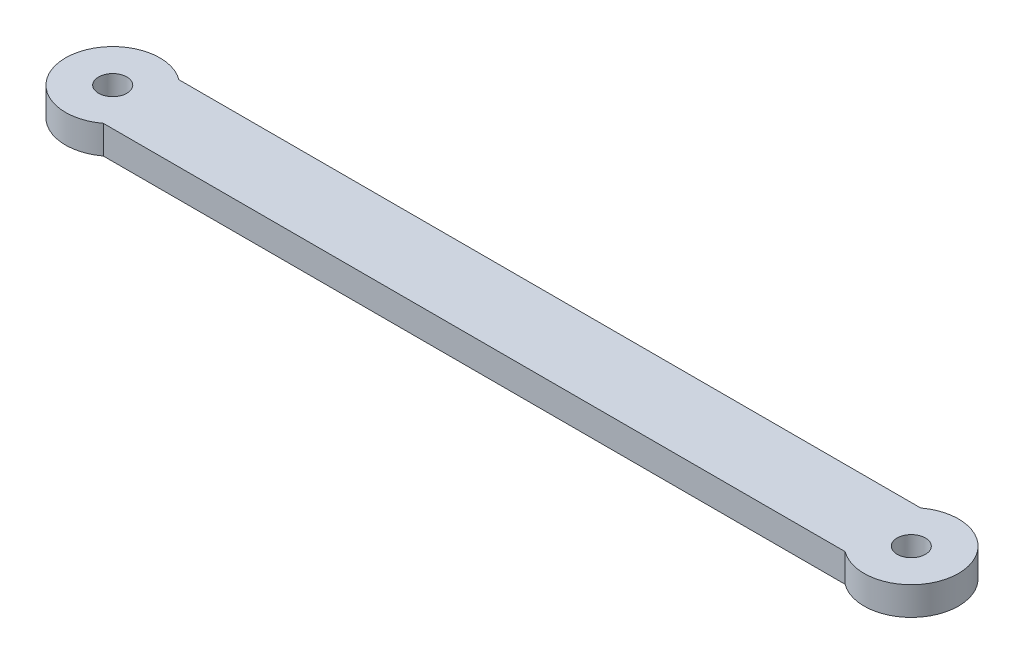
ISO-10303-21;
HEADER;
FILE_DESCRIPTION(('STEP AP214'),'2;1');
FILE_NAME('part.step','',(''),(''),'','','');
FILE_SCHEMA(('AUTOMOTIVE_DESIGN { 1 0 10303 214 1 1 1 1 }'));
ENDSEC;
DATA;
#1=APPLICATION_CONTEXT('core data for automotive mechanical design processes');
#2=APPLICATION_PROTOCOL_DEFINITION('international standard','automotive_design',2000,#1);
#3=PRODUCT_CONTEXT('',#1,'mechanical');
#4=PRODUCT('Part','Part','',(#3));
#5=PRODUCT_RELATED_PRODUCT_CATEGORY('part','',(#4));
#6=PRODUCT_DEFINITION_FORMATION('','',#4);
#7=PRODUCT_DEFINITION_CONTEXT('part definition',#1,'design');
#8=PRODUCT_DEFINITION('design','',#6,#7);
#9=PRODUCT_DEFINITION_SHAPE('','',#8);
#10=(LENGTH_UNIT() NAMED_UNIT(*) SI_UNIT(.MILLI.,.METRE.));
#11=(NAMED_UNIT(*) PLANE_ANGLE_UNIT() SI_UNIT($,.RADIAN.));
#12=(NAMED_UNIT(*) SI_UNIT($,.STERADIAN.) SOLID_ANGLE_UNIT());
#13=UNCERTAINTY_MEASURE_WITH_UNIT(LENGTH_MEASURE(1.E-05),#10,'distance_accuracy_value','');
#14=(GEOMETRIC_REPRESENTATION_CONTEXT(3) GLOBAL_UNCERTAINTY_ASSIGNED_CONTEXT((#13)) GLOBAL_UNIT_ASSIGNED_CONTEXT((#10,
#11,#12)) REPRESENTATION_CONTEXT('',''));
#15=CARTESIAN_POINT('',(0.,0.,0.));
#16=DIRECTION('',(0.,0.,1.));
#17=DIRECTION('',(1.,0.,0.));
#18=AXIS2_PLACEMENT_3D('',#15,#16,#17);
#19=CARTESIAN_POINT('',(42.26805,3.,0.));
#20=DIRECTION('',(0.,-1.,0.));
#21=DIRECTION('',(0.,0.,-1.));
#22=AXIS2_PLACEMENT_3D('',#19,#20,#21);
#23=PLANE('',#22);
#24=CARTESIAN_POINT('',(42.26805,3.,0.));
#25=DIRECTION('',(0.,1.,0.));
#26=DIRECTION('',(0.,0.,-1.));
#27=AXIS2_PLACEMENT_3D('',#24,#25,#26);
#28=CIRCLE('',#27,5.);
#29=CARTESIAN_POINT('',(39.26805,3.,4.));
#30=VERTEX_POINT('',#29);
#31=CARTESIAN_POINT('',(39.26805,3.,-4.));
#32=VERTEX_POINT('',#31);
#33=EDGE_CURVE('E90',#30,#32,#28,.T.);
#34=ORIENTED_EDGE('',*,*,#33,.T.);
#35=DIRECTION('',(-1.,0.,0.));
#36=VECTOR('',#35,1.);
#37=CARTESIAN_POINT('',(-39.26805,3.,-4.));
#38=LINE('',#37,#36);
#39=CARTESIAN_POINT('',(-39.26805,3.,-4.));
#40=VERTEX_POINT('',#39);
#41=EDGE_CURVE('E85',#32,#40,#38,.T.);
#42=ORIENTED_EDGE('',*,*,#41,.T.);
#43=CARTESIAN_POINT('',(-42.26805,3.,0.));
#44=DIRECTION('',(0.,1.,0.));
#45=DIRECTION('',(0.,0.,1.));
#46=AXIS2_PLACEMENT_3D('',#43,#44,#45);
#47=CIRCLE('',#46,5.);
#48=CARTESIAN_POINT('',(-39.26805,3.,4.));
#49=VERTEX_POINT('',#48);
#50=EDGE_CURVE('E88',#40,#49,#47,.T.);
#51=ORIENTED_EDGE('',*,*,#50,.T.);
#52=DIRECTION('',(1.,0.,0.));
#53=VECTOR('',#52,1.);
#54=CARTESIAN_POINT('',(39.26805,3.,4.));
#55=LINE('',#54,#53);
#56=EDGE_CURVE('E55',#49,#30,#55,.T.);
#57=ORIENTED_EDGE('',*,*,#56,.T.);
#58=EDGE_LOOP('',(#34,#42,#51,#57));
#59=FACE_BOUND('',#58,.T.);
#60=CARTESIAN_POINT('',(-42.26805,3.,0.));
#61=DIRECTION('',(0.,1.,0.));
#62=DIRECTION('',(0.,0.,1.));
#63=AXIS2_PLACEMENT_3D('',#60,#61,#62);
#64=CIRCLE('',#63,1.5);
#65=CARTESIAN_POINT('',(-42.26805,3.,1.5));
#66=VERTEX_POINT('',#65);
#67=EDGE_CURVE('E105',#66,#66,#64,.T.);
#68=ORIENTED_EDGE('',*,*,#67,.F.);
#69=EDGE_LOOP('',(#68));
#70=FACE_BOUND('',#69,.T.);
#71=CARTESIAN_POINT('',(42.26805,3.,0.));
#72=DIRECTION('',(0.,1.,0.));
#73=DIRECTION('',(0.,0.,-1.));
#74=AXIS2_PLACEMENT_3D('',#71,#72,#73);
#75=CIRCLE('',#74,1.5);
#76=CARTESIAN_POINT('',(42.26805,3.,-1.5));
#77=VERTEX_POINT('',#76);
#78=EDGE_CURVE('E120',#77,#77,#75,.T.);
#79=ORIENTED_EDGE('',*,*,#78,.F.);
#80=EDGE_LOOP('',(#79));
#81=FACE_BOUND('',#80,.T.);
#82=ADVANCED_FACE('F38',(#59,#70,#81),#23,.F.);
#83=CARTESIAN_POINT('',(42.26805,0.,0.));
#84=DIRECTION('',(0.,-1.,0.));
#85=DIRECTION('',(0.,0.,-1.));
#86=AXIS2_PLACEMENT_3D('',#83,#84,#85);
#87=PLANE('',#86);
#88=CARTESIAN_POINT('',(-42.26805,0.,0.));
#89=DIRECTION('',(0.,1.,0.));
#90=DIRECTION('',(0.,0.,1.));
#91=AXIS2_PLACEMENT_3D('',#88,#89,#90);
#92=CIRCLE('',#91,1.5);
#93=CARTESIAN_POINT('',(-42.26805,0.,1.5));
#94=VERTEX_POINT('',#93);
#95=EDGE_CURVE('E117',#94,#94,#92,.T.);
#96=ORIENTED_EDGE('',*,*,#95,.T.);
#97=EDGE_LOOP('',(#96));
#98=FACE_BOUND('',#97,.T.);
#99=CARTESIAN_POINT('',(42.26805,0.,0.));
#100=DIRECTION('',(0.,1.,0.));
#101=DIRECTION('',(0.,0.,-1.));
#102=AXIS2_PLACEMENT_3D('',#99,#100,#101);
#103=CIRCLE('',#102,5.);
#104=CARTESIAN_POINT('',(39.26805,0.,4.));
#105=VERTEX_POINT('',#104);
#106=CARTESIAN_POINT('',(39.26805,0.,-4.));
#107=VERTEX_POINT('',#106);
#108=EDGE_CURVE('E102',#105,#107,#103,.T.);
#109=ORIENTED_EDGE('',*,*,#108,.F.);
#110=DIRECTION('',(1.,0.,0.));
#111=VECTOR('',#110,1.);
#112=CARTESIAN_POINT('',(39.26805,0.,4.));
#113=LINE('',#112,#111);
#114=CARTESIAN_POINT('',(-39.26805,0.,4.));
#115=VERTEX_POINT('',#114);
#116=EDGE_CURVE('E78',#115,#105,#113,.T.);
#117=ORIENTED_EDGE('',*,*,#116,.F.);
#118=CARTESIAN_POINT('',(-42.26805,0.,0.));
#119=DIRECTION('',(0.,1.,0.));
#120=DIRECTION('',(0.,0.,1.));
#121=AXIS2_PLACEMENT_3D('',#118,#119,#120);
#122=CIRCLE('',#121,5.);
#123=CARTESIAN_POINT('',(-39.26805,0.,-4.));
#124=VERTEX_POINT('',#123);
#125=EDGE_CURVE('E72',#124,#115,#122,.T.);
#126=ORIENTED_EDGE('',*,*,#125,.F.);
#127=DIRECTION('',(-1.,0.,0.));
#128=VECTOR('',#127,1.);
#129=CARTESIAN_POINT('',(-39.26805,0.,-4.));
#130=LINE('',#129,#128);
#131=EDGE_CURVE('E94',#107,#124,#130,.T.);
#132=ORIENTED_EDGE('',*,*,#131,.F.);
#133=EDGE_LOOP('',(#109,#117,#126,#132));
#134=FACE_BOUND('',#133,.T.);
#135=CARTESIAN_POINT('',(42.26805,0.,0.));
#136=DIRECTION('',(0.,1.,0.));
#137=DIRECTION('',(0.,0.,-1.));
#138=AXIS2_PLACEMENT_3D('',#135,#136,#137);
#139=CIRCLE('',#138,1.5);
#140=CARTESIAN_POINT('',(42.26805,0.,-1.5));
#141=VERTEX_POINT('',#140);
#142=EDGE_CURVE('E123',#141,#141,#139,.T.);
#143=ORIENTED_EDGE('',*,*,#142,.T.);
#144=EDGE_LOOP('',(#143));
#145=FACE_BOUND('',#144,.T.);
#146=ADVANCED_FACE('F113',(#98,#134,#145),#87,.T.);
#147=CARTESIAN_POINT('',(42.26805,3.,0.));
#148=DIRECTION('',(0.,-1.,0.));
#149=DIRECTION('',(0.,0.,-1.));
#150=AXIS2_PLACEMENT_3D('',#147,#148,#149);
#151=CYLINDRICAL_SURFACE('',#150,5.);
#152=ORIENTED_EDGE('',*,*,#108,.T.);
#153=DIRECTION('',(0.,-1.,0.));
#154=VECTOR('',#153,1.);
#155=CARTESIAN_POINT('',(39.26805,3.,-4.));
#156=LINE('',#155,#154);
#157=EDGE_CURVE('E11',#32,#107,#156,.T.);
#158=ORIENTED_EDGE('',*,*,#157,.F.);
#159=ORIENTED_EDGE('',*,*,#33,.F.);
#160=DIRECTION('',(0.,-1.,0.));
#161=VECTOR('',#160,1.);
#162=CARTESIAN_POINT('',(39.26805,3.,4.));
#163=LINE('',#162,#161);
#164=EDGE_CURVE('E98',#30,#105,#163,.T.);
#165=ORIENTED_EDGE('',*,*,#164,.T.);
#166=EDGE_LOOP('',(#152,#158,#159,#165));
#167=FACE_BOUND('',#166,.T.);
#168=ADVANCED_FACE('F40',(#167),#151,.T.);
#169=CARTESIAN_POINT('',(-39.26805,3.,-4.));
#170=DIRECTION('',(0.,0.,1.));
#171=DIRECTION('',(1.,0.,0.));
#172=AXIS2_PLACEMENT_3D('',#169,#170,#171);
#173=PLANE('',#172);
#174=ORIENTED_EDGE('',*,*,#131,.T.);
#175=DIRECTION('',(0.,-1.,0.));
#176=VECTOR('',#175,1.);
#177=CARTESIAN_POINT('',(-39.26805,3.,-4.));
#178=LINE('',#177,#176);
#179=EDGE_CURVE('E47',#40,#124,#178,.T.);
#180=ORIENTED_EDGE('',*,*,#179,.F.);
#181=ORIENTED_EDGE('',*,*,#41,.F.);
#182=ORIENTED_EDGE('',*,*,#157,.T.);
#183=EDGE_LOOP('',(#174,#180,#181,#182));
#184=FACE_BOUND('',#183,.T.);
#185=ADVANCED_FACE('F93',(#184),#173,.F.);
#186=CARTESIAN_POINT('',(-42.26805,3.,0.));
#187=DIRECTION('',(0.,-1.,0.));
#188=DIRECTION('',(0.,0.,-1.));
#189=AXIS2_PLACEMENT_3D('',#186,#187,#188);
#190=CYLINDRICAL_SURFACE('',#189,5.);
#191=ORIENTED_EDGE('',*,*,#125,.T.);
#192=DIRECTION('',(0.,-1.,0.));
#193=VECTOR('',#192,1.);
#194=CARTESIAN_POINT('',(-39.26805,3.,4.));
#195=LINE('',#194,#193);
#196=EDGE_CURVE('E95',#49,#115,#195,.T.);
#197=ORIENTED_EDGE('',*,*,#196,.F.);
#198=ORIENTED_EDGE('',*,*,#50,.F.);
#199=ORIENTED_EDGE('',*,*,#179,.T.);
#200=EDGE_LOOP('',(#191,#197,#198,#199));
#201=FACE_BOUND('',#200,.T.);
#202=ADVANCED_FACE('F96',(#201),#190,.T.);
#203=CARTESIAN_POINT('',(39.26805,3.,4.));
#204=DIRECTION('',(0.,0.,-1.));
#205=DIRECTION('',(-1.,0.,0.));
#206=AXIS2_PLACEMENT_3D('',#203,#204,#205);
#207=PLANE('',#206);
#208=ORIENTED_EDGE('',*,*,#116,.T.);
#209=ORIENTED_EDGE('',*,*,#164,.F.);
#210=ORIENTED_EDGE('',*,*,#56,.F.);
#211=ORIENTED_EDGE('',*,*,#196,.T.);
#212=EDGE_LOOP('',(#208,#209,#210,#211));
#213=FACE_BOUND('',#212,.T.);
#214=ADVANCED_FACE('F110',(#213),#207,.F.);
#215=CARTESIAN_POINT('',(-42.26805,3.,0.));
#216=DIRECTION('',(0.,-1.,0.));
#217=DIRECTION('',(0.,0.,-1.));
#218=AXIS2_PLACEMENT_3D('',#215,#216,#217);
#219=CYLINDRICAL_SURFACE('',#218,1.5);
#220=ORIENTED_EDGE('',*,*,#67,.T.);
#221=EDGE_LOOP('',(#220));
#222=FACE_BOUND('',#221,.T.);
#223=ORIENTED_EDGE('',*,*,#95,.F.);
#224=EDGE_LOOP('',(#223));
#225=FACE_BOUND('',#224,.T.);
#226=ADVANCED_FACE('F140',(#222,#225),#219,.F.);
#227=CARTESIAN_POINT('',(42.26805,3.,0.));
#228=DIRECTION('',(0.,-1.,0.));
#229=DIRECTION('',(0.,0.,-1.));
#230=AXIS2_PLACEMENT_3D('',#227,#228,#229);
#231=CYLINDRICAL_SURFACE('',#230,1.5);
#232=ORIENTED_EDGE('',*,*,#78,.T.);
#233=EDGE_LOOP('',(#232));
#234=FACE_BOUND('',#233,.T.);
#235=ORIENTED_EDGE('',*,*,#142,.F.);
#236=EDGE_LOOP('',(#235));
#237=FACE_BOUND('',#236,.T.);
#238=ADVANCED_FACE('F129',(#234,#237),#231,.F.);
#239=CLOSED_SHELL('',(#82,#146,#168,#185,#202,#214,#226,#238));
#240=MANIFOLD_SOLID_BREP('B2',#239);
#241=ADVANCED_BREP_SHAPE_REPRESENTATION('',(#18,#240),#14);
#242=SHAPE_DEFINITION_REPRESENTATION(#9,#241);
ENDSEC;
END-ISO-10303-21;
